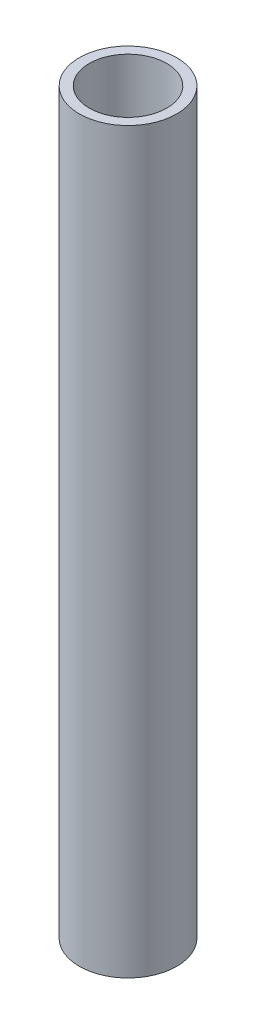
ISO-10303-21;
HEADER;
FILE_DESCRIPTION(('STEP AP214'),'2;1');
FILE_NAME('part.step','',(''),(''),'','','');
FILE_SCHEMA(('AUTOMOTIVE_DESIGN { 1 0 10303 214 1 1 1 1 }'));
ENDSEC;
DATA;
#1=APPLICATION_CONTEXT('core data for automotive mechanical design processes');
#2=APPLICATION_PROTOCOL_DEFINITION('international standard','automotive_design',2000,#1);
#3=PRODUCT_CONTEXT('',#1,'mechanical');
#4=PRODUCT('Part','Part','',(#3));
#5=PRODUCT_RELATED_PRODUCT_CATEGORY('part','',(#4));
#6=PRODUCT_DEFINITION_FORMATION('','',#4);
#7=PRODUCT_DEFINITION_CONTEXT('part definition',#1,'design');
#8=PRODUCT_DEFINITION('design','',#6,#7);
#9=PRODUCT_DEFINITION_SHAPE('','',#8);
#10=(LENGTH_UNIT() NAMED_UNIT(*) SI_UNIT(.MILLI.,.METRE.));
#11=(NAMED_UNIT(*) PLANE_ANGLE_UNIT() SI_UNIT($,.RADIAN.));
#12=(NAMED_UNIT(*) SI_UNIT($,.STERADIAN.) SOLID_ANGLE_UNIT());
#13=UNCERTAINTY_MEASURE_WITH_UNIT(LENGTH_MEASURE(1.E-05),#10,'distance_accuracy_value','');
#14=(GEOMETRIC_REPRESENTATION_CONTEXT(3) GLOBAL_UNCERTAINTY_ASSIGNED_CONTEXT((#13)) GLOBAL_UNIT_ASSIGNED_CONTEXT((#10,
#11,#12)) REPRESENTATION_CONTEXT('',''));
#15=CARTESIAN_POINT('',(0.,0.,0.));
#16=DIRECTION('',(0.,0.,1.));
#17=DIRECTION('',(1.,0.,0.));
#18=AXIS2_PLACEMENT_3D('',#15,#16,#17);
#19=CARTESIAN_POINT('',(0.,127.,0.));
#20=DIRECTION('',(0.,-1.,0.));
#21=DIRECTION('',(0.,0.,-1.));
#22=AXIS2_PLACEMENT_3D('',#19,#20,#21);
#23=CYLINDRICAL_SURFACE('',#22,13.335);
#24=CARTESIAN_POINT('',(0.,127.,0.));
#25=DIRECTION('',(0.,1.,0.));
#26=DIRECTION('',(1.,0.,0.));
#27=AXIS2_PLACEMENT_3D('',#24,#25,#26);
#28=CIRCLE('',#27,13.335);
#29=CARTESIAN_POINT('',(13.335,127.,0.));
#30=VERTEX_POINT('',#29);
#31=EDGE_CURVE('E9',#30,#30,#28,.T.);
#32=ORIENTED_EDGE('',*,*,#31,.T.);
#33=EDGE_LOOP('',(#32));
#34=FACE_BOUND('',#33,.T.);
#35=CARTESIAN_POINT('',(0.,-127.,0.));
#36=DIRECTION('',(0.,1.,0.));
#37=DIRECTION('',(1.,0.,0.));
#38=AXIS2_PLACEMENT_3D('',#35,#36,#37);
#39=CIRCLE('',#38,13.335);
#40=CARTESIAN_POINT('',(13.335,-127.,0.));
#41=VERTEX_POINT('',#40);
#42=EDGE_CURVE('E28',#41,#41,#39,.T.);
#43=ORIENTED_EDGE('',*,*,#42,.F.);
#44=EDGE_LOOP('',(#43));
#45=FACE_BOUND('',#44,.T.);
#46=ADVANCED_FACE('F14',(#34,#45),#23,.F.);
#47=CARTESIAN_POINT('',(0.,127.,0.));
#48=DIRECTION('',(0.,-1.,0.));
#49=DIRECTION('',(0.,0.,-1.));
#50=AXIS2_PLACEMENT_3D('',#47,#48,#49);
#51=CYLINDRICAL_SURFACE('',#50,16.764);
#52=CARTESIAN_POINT('',(0.,127.,0.));
#53=DIRECTION('',(0.,1.,0.));
#54=DIRECTION('',(1.,0.,0.));
#55=AXIS2_PLACEMENT_3D('',#52,#53,#54);
#56=CIRCLE('',#55,16.764);
#57=CARTESIAN_POINT('',(16.764,127.,0.));
#58=VERTEX_POINT('',#57);
#59=EDGE_CURVE('E26',#58,#58,#56,.T.);
#60=ORIENTED_EDGE('',*,*,#59,.F.);
#61=EDGE_LOOP('',(#60));
#62=FACE_BOUND('',#61,.T.);
#63=CARTESIAN_POINT('',(0.,-127.,0.));
#64=DIRECTION('',(0.,1.,0.));
#65=DIRECTION('',(1.,0.,0.));
#66=AXIS2_PLACEMENT_3D('',#63,#64,#65);
#67=CIRCLE('',#66,16.764);
#68=CARTESIAN_POINT('',(16.764,-127.,0.));
#69=VERTEX_POINT('',#68);
#70=EDGE_CURVE('E18',#69,#69,#67,.T.);
#71=ORIENTED_EDGE('',*,*,#70,.T.);
#72=EDGE_LOOP('',(#71));
#73=FACE_BOUND('',#72,.T.);
#74=ADVANCED_FACE('F16',(#62,#73),#51,.T.);
#75=CARTESIAN_POINT('',(0.,127.,0.));
#76=DIRECTION('',(0.,1.,0.));
#77=DIRECTION('',(0.,0.,1.));
#78=AXIS2_PLACEMENT_3D('',#75,#76,#77);
#79=PLANE('',#78);
#80=ORIENTED_EDGE('',*,*,#59,.T.);
#81=EDGE_LOOP('',(#80));
#82=FACE_BOUND('',#81,.T.);
#83=ORIENTED_EDGE('',*,*,#31,.F.);
#84=EDGE_LOOP('',(#83));
#85=FACE_BOUND('',#84,.T.);
#86=ADVANCED_FACE('F33',(#82,#85),#79,.T.);
#87=CARTESIAN_POINT('',(0.,-127.,0.));
#88=DIRECTION('',(0.,1.,0.));
#89=DIRECTION('',(0.,0.,1.));
#90=AXIS2_PLACEMENT_3D('',#87,#88,#89);
#91=PLANE('',#90);
#92=ORIENTED_EDGE('',*,*,#70,.F.);
#93=EDGE_LOOP('',(#92));
#94=FACE_BOUND('',#93,.T.);
#95=ORIENTED_EDGE('',*,*,#42,.T.);
#96=EDGE_LOOP('',(#95));
#97=FACE_BOUND('',#96,.T.);
#98=ADVANCED_FACE('F40',(#94,#97),#91,.F.);
#99=CLOSED_SHELL('',(#46,#74,#86,#98));
#100=MANIFOLD_SOLID_BREP('B1',#99);
#101=ADVANCED_BREP_SHAPE_REPRESENTATION('',(#18,#100),#14);
#102=SHAPE_DEFINITION_REPRESENTATION(#9,#101);
ENDSEC;
END-ISO-10303-21;
